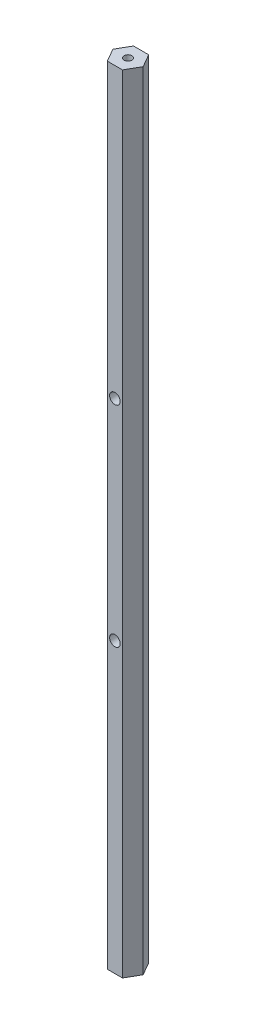
ISO-10303-21;
HEADER;
FILE_DESCRIPTION(('STEP AP214'),'2;1');
FILE_NAME('part.step','',(''),(''),'','','');
FILE_SCHEMA(('AUTOMOTIVE_DESIGN { 1 0 10303 214 1 1 1 1 }'));
ENDSEC;
DATA;
#1=APPLICATION_CONTEXT('core data for automotive mechanical design processes');
#2=APPLICATION_PROTOCOL_DEFINITION('international standard','automotive_design',2000,#1);
#3=PRODUCT_CONTEXT('',#1,'mechanical');
#4=PRODUCT('Part','Part','',(#3));
#5=PRODUCT_RELATED_PRODUCT_CATEGORY('part','',(#4));
#6=PRODUCT_DEFINITION_FORMATION('','',#4);
#7=PRODUCT_DEFINITION_CONTEXT('part definition',#1,'design');
#8=PRODUCT_DEFINITION('design','',#6,#7);
#9=PRODUCT_DEFINITION_SHAPE('','',#8);
#10=(LENGTH_UNIT() NAMED_UNIT(*) SI_UNIT(.MILLI.,.METRE.));
#11=(NAMED_UNIT(*) PLANE_ANGLE_UNIT() SI_UNIT($,.RADIAN.));
#12=(NAMED_UNIT(*) SI_UNIT($,.STERADIAN.) SOLID_ANGLE_UNIT());
#13=UNCERTAINTY_MEASURE_WITH_UNIT(LENGTH_MEASURE(1.E-05),#10,'distance_accuracy_value','');
#14=(GEOMETRIC_REPRESENTATION_CONTEXT(3) GLOBAL_UNCERTAINTY_ASSIGNED_CONTEXT((#13)) GLOBAL_UNIT_ASSIGNED_CONTEXT((#10,
#11,#12)) REPRESENTATION_CONTEXT('',''));
#15=CARTESIAN_POINT('',(0.,0.,0.));
#16=DIRECTION('',(0.,0.,1.));
#17=DIRECTION('',(1.,0.,0.));
#18=AXIS2_PLACEMENT_3D('',#15,#16,#17);
#19=CARTESIAN_POINT('',(3.66617420935418,381.,6.34999999999993));
#20=DIRECTION('',(-0.866025403784441,0.,-0.499999999999995));
#21=DIRECTION('',(-0.499999999999995,0.,0.866025403784442));
#22=AXIS2_PLACEMENT_3D('',#19,#20,#21);
#23=PLANE('',#22);
#24=DIRECTION('',(0.499999999999995,0.,-0.866025403784441));
#25=VECTOR('',#24,1.);
#26=CARTESIAN_POINT('',(3.66617420935418,0.,6.34999999999993));
#27=LINE('',#26,#25);
#28=CARTESIAN_POINT('',(3.66617420935418,0.,6.34999999999993));
#29=VERTEX_POINT('',#28);
#30=CARTESIAN_POINT('',(7.33234841870822,0.,0.));
#31=VERTEX_POINT('',#30);
#32=EDGE_CURVE('E120',#29,#31,#27,.T.);
#33=ORIENTED_EDGE('',*,*,#32,.T.);
#34=DIRECTION('',(0.,-1.,0.));
#35=VECTOR('',#34,1.);
#36=CARTESIAN_POINT('',(7.33234841870822,381.,0.));
#37=LINE('',#36,#35);
#38=CARTESIAN_POINT('',(7.33234841870822,381.,0.));
#39=VERTEX_POINT('',#38);
#40=EDGE_CURVE('E11',#39,#31,#37,.T.);
#41=ORIENTED_EDGE('',*,*,#40,.F.);
#42=DIRECTION('',(0.499999999999995,0.,-0.866025403784441));
#43=VECTOR('',#42,1.);
#44=CARTESIAN_POINT('',(3.66617420935418,381.,6.34999999999993));
#45=LINE('',#44,#43);
#46=CARTESIAN_POINT('',(3.66617420935418,381.,6.34999999999993));
#47=VERTEX_POINT('',#46);
#48=EDGE_CURVE('E131',#47,#39,#45,.T.);
#49=ORIENTED_EDGE('',*,*,#48,.F.);
#50=DIRECTION('',(0.,-1.,0.));
#51=VECTOR('',#50,1.);
#52=CARTESIAN_POINT('',(3.66617420935418,381.,6.34999999999993));
#53=LINE('',#52,#51);
#54=EDGE_CURVE('E116',#47,#29,#53,.T.);
#55=ORIENTED_EDGE('',*,*,#54,.T.);
#56=EDGE_LOOP('',(#33,#41,#49,#55));
#57=FACE_BOUND('',#56,.T.);
#58=ADVANCED_FACE('F33',(#57),#23,.F.);
#59=CARTESIAN_POINT('',(7.33234841870822,381.,0.));
#60=DIRECTION('',(-0.866025403784438,0.,0.500000000000001));
#61=DIRECTION('',(0.500000000000001,0.,0.866025403784438));
#62=AXIS2_PLACEMENT_3D('',#59,#60,#61);
#63=PLANE('',#62);
#64=DIRECTION('',(-0.500000000000001,0.,-0.866025403784438));
#65=VECTOR('',#64,1.);
#66=CARTESIAN_POINT('',(7.33234841870822,0.,0.));
#67=LINE('',#66,#65);
#68=CARTESIAN_POINT('',(3.6661742093541,0.,-6.34999999999998));
#69=VERTEX_POINT('',#68);
#70=EDGE_CURVE('E123',#31,#69,#67,.T.);
#71=ORIENTED_EDGE('',*,*,#70,.T.);
#72=DIRECTION('',(0.,-1.,0.));
#73=VECTOR('',#72,1.);
#74=CARTESIAN_POINT('',(3.6661742093541,381.,-6.34999999999998));
#75=LINE('',#74,#73);
#76=CARTESIAN_POINT('',(3.6661742093541,381.,-6.34999999999998));
#77=VERTEX_POINT('',#76);
#78=EDGE_CURVE('E41',#77,#69,#75,.T.);
#79=ORIENTED_EDGE('',*,*,#78,.F.);
#80=DIRECTION('',(-0.500000000000001,0.,-0.866025403784438));
#81=VECTOR('',#80,1.);
#82=CARTESIAN_POINT('',(7.33234841870822,381.,0.));
#83=LINE('',#82,#81);
#84=EDGE_CURVE('E87',#39,#77,#83,.T.);
#85=ORIENTED_EDGE('',*,*,#84,.F.);
#86=ORIENTED_EDGE('',*,*,#40,.T.);
#87=EDGE_LOOP('',(#71,#79,#85,#86));
#88=FACE_BOUND('',#87,.T.);
#89=ADVANCED_FACE('F161',(#88),#63,.F.);
#90=CARTESIAN_POINT('',(3.6661742093541,381.,-6.34999999999998));
#91=DIRECTION('',(0.,0.,1.));
#92=DIRECTION('',(1.,0.,0.));
#93=AXIS2_PLACEMENT_3D('',#90,#91,#92);
#94=PLANE('',#93);
#95=CARTESIAN_POINT('',(0.,139.7,-6.34999999999997));
#96=DIRECTION('',(0.,0.,-1.));
#97=DIRECTION('',(-1.,0.,0.));
#98=AXIS2_PLACEMENT_3D('',#95,#96,#97);
#99=CIRCLE('',#98,2.5527);
#100=CARTESIAN_POINT('',(-2.55270000000002,139.7,-6.34999999999997));
#101=VERTEX_POINT('',#100);
#102=EDGE_CURVE('E264',#101,#101,#99,.T.);
#103=ORIENTED_EDGE('',*,*,#102,.F.);
#104=EDGE_LOOP('',(#103));
#105=FACE_BOUND('',#104,.T.);
#106=CARTESIAN_POINT('',(0.,241.3,-6.34999999999997));
#107=DIRECTION('',(0.,0.,-1.));
#108=DIRECTION('',(-1.,0.,0.));
#109=AXIS2_PLACEMENT_3D('',#106,#107,#108);
#110=CIRCLE('',#109,2.5527);
#111=CARTESIAN_POINT('',(-2.55270000000002,241.3,-6.34999999999997));
#112=VERTEX_POINT('',#111);
#113=EDGE_CURVE('E266',#112,#112,#110,.T.);
#114=ORIENTED_EDGE('',*,*,#113,.F.);
#115=EDGE_LOOP('',(#114));
#116=FACE_BOUND('',#115,.T.);
#117=DIRECTION('',(-1.,0.,0.));
#118=VECTOR('',#117,1.);
#119=CARTESIAN_POINT('',(3.6661742093541,0.,-6.34999999999998));
#120=LINE('',#119,#118);
#121=CARTESIAN_POINT('',(-3.66617420935414,0.,-6.34999999999996));
#122=VERTEX_POINT('',#121);
#123=EDGE_CURVE('E126',#69,#122,#120,.T.);
#124=ORIENTED_EDGE('',*,*,#123,.T.);
#125=DIRECTION('',(0.,-1.,0.));
#126=VECTOR('',#125,1.);
#127=CARTESIAN_POINT('',(-3.66617420935414,381.,-6.34999999999996));
#128=LINE('',#127,#126);
#129=CARTESIAN_POINT('',(-3.66617420935414,381.,-6.34999999999996));
#130=VERTEX_POINT('',#129);
#131=EDGE_CURVE('E111',#130,#122,#128,.T.);
#132=ORIENTED_EDGE('',*,*,#131,.F.);
#133=DIRECTION('',(-1.,0.,0.));
#134=VECTOR('',#133,1.);
#135=CARTESIAN_POINT('',(3.6661742093541,381.,-6.34999999999998));
#136=LINE('',#135,#134);
#137=EDGE_CURVE('E102',#77,#130,#136,.T.);
#138=ORIENTED_EDGE('',*,*,#137,.F.);
#139=ORIENTED_EDGE('',*,*,#78,.T.);
#140=EDGE_LOOP('',(#124,#132,#138,#139));
#141=FACE_BOUND('',#140,.T.);
#142=ADVANCED_FACE('F137',(#105,#116,#141),#94,.F.);
#143=CARTESIAN_POINT('',(-3.66617420935414,381.,-6.34999999999996));
#144=DIRECTION('',(0.866025403784441,0.,0.499999999999995));
#145=DIRECTION('',(0.499999999999995,0.,-0.866025403784442));
#146=AXIS2_PLACEMENT_3D('',#143,#144,#145);
#147=PLANE('',#146);
#148=DIRECTION('',(-0.499999999999995,0.,0.866025403784442));
#149=VECTOR('',#148,1.);
#150=CARTESIAN_POINT('',(-3.66617420935414,0.,-6.34999999999996));
#151=LINE('',#150,#149);
#152=CARTESIAN_POINT('',(-7.33234841870822,0.,0.));
#153=VERTEX_POINT('',#152);
#154=EDGE_CURVE('E110',#122,#153,#151,.T.);
#155=ORIENTED_EDGE('',*,*,#154,.T.);
#156=DIRECTION('',(0.,-1.,0.));
#157=VECTOR('',#156,1.);
#158=CARTESIAN_POINT('',(-7.33234841870822,381.,0.));
#159=LINE('',#158,#157);
#160=CARTESIAN_POINT('',(-7.33234841870822,381.,0.));
#161=VERTEX_POINT('',#160);
#162=EDGE_CURVE('E107',#161,#153,#159,.T.);
#163=ORIENTED_EDGE('',*,*,#162,.F.);
#164=DIRECTION('',(-0.499999999999995,0.,0.866025403784442));
#165=VECTOR('',#164,1.);
#166=CARTESIAN_POINT('',(-3.66617420935414,381.,-6.34999999999996));
#167=LINE('',#166,#165);
#168=EDGE_CURVE('E96',#130,#161,#167,.T.);
#169=ORIENTED_EDGE('',*,*,#168,.F.);
#170=ORIENTED_EDGE('',*,*,#131,.T.);
#171=EDGE_LOOP('',(#155,#163,#169,#170));
#172=FACE_BOUND('',#171,.T.);
#173=ADVANCED_FACE('F108',(#172),#147,.F.);
#174=CARTESIAN_POINT('',(-7.33234841870822,381.,0.));
#175=DIRECTION('',(0.866025403784435,0.,-0.500000000000007));
#176=DIRECTION('',(-0.500000000000007,0.,-0.866025403784435));
#177=AXIS2_PLACEMENT_3D('',#174,#175,#176);
#178=PLANE('',#177);
#179=DIRECTION('',(0.500000000000007,0.,0.866025403784435));
#180=VECTOR('',#179,1.);
#181=CARTESIAN_POINT('',(-7.33234841870822,0.,0.));
#182=LINE('',#181,#180);
#183=CARTESIAN_POINT('',(-3.66617420935405,0.,6.35000000000001));
#184=VERTEX_POINT('',#183);
#185=EDGE_CURVE('E73',#153,#184,#182,.T.);
#186=ORIENTED_EDGE('',*,*,#185,.T.);
#187=DIRECTION('',(0.,-1.,0.));
#188=VECTOR('',#187,1.);
#189=CARTESIAN_POINT('',(-3.66617420935405,381.,6.35000000000001));
#190=LINE('',#189,#188);
#191=CARTESIAN_POINT('',(-3.66617420935405,381.,6.35000000000001));
#192=VERTEX_POINT('',#191);
#193=EDGE_CURVE('E112',#192,#184,#190,.T.);
#194=ORIENTED_EDGE('',*,*,#193,.F.);
#195=DIRECTION('',(0.500000000000007,0.,0.866025403784435));
#196=VECTOR('',#195,1.);
#197=CARTESIAN_POINT('',(-7.33234841870822,381.,0.));
#198=LINE('',#197,#196);
#199=EDGE_CURVE('E100',#161,#192,#198,.T.);
#200=ORIENTED_EDGE('',*,*,#199,.F.);
#201=ORIENTED_EDGE('',*,*,#162,.T.);
#202=EDGE_LOOP('',(#186,#194,#200,#201));
#203=FACE_BOUND('',#202,.T.);
#204=ADVANCED_FACE('F114',(#203),#178,.F.);
#205=CARTESIAN_POINT('',(-3.66617420935405,381.,6.35000000000001));
#206=DIRECTION('',(0.,0.,-1.));
#207=DIRECTION('',(-1.,0.,0.));
#208=AXIS2_PLACEMENT_3D('',#205,#206,#207);
#209=PLANE('',#208);
#210=CARTESIAN_POINT('',(0.,139.7,6.35000000000004));
#211=DIRECTION('',(0.,0.,-1.));
#212=DIRECTION('',(-1.,0.,0.));
#213=AXIS2_PLACEMENT_3D('',#210,#211,#212);
#214=CIRCLE('',#213,2.5527);
#215=CARTESIAN_POINT('',(-2.55270000000002,139.7,6.35000000000004));
#216=VERTEX_POINT('',#215);
#217=EDGE_CURVE('E261',#216,#216,#214,.T.);
#218=ORIENTED_EDGE('',*,*,#217,.T.);
#219=EDGE_LOOP('',(#218));
#220=FACE_BOUND('',#219,.T.);
#221=CARTESIAN_POINT('',(0.,241.3,6.35000000000004));
#222=DIRECTION('',(0.,0.,-1.));
#223=DIRECTION('',(-1.,0.,0.));
#224=AXIS2_PLACEMENT_3D('',#221,#222,#223);
#225=CIRCLE('',#224,2.5527);
#226=CARTESIAN_POINT('',(-2.55270000000002,241.3,6.35000000000004));
#227=VERTEX_POINT('',#226);
#228=EDGE_CURVE('E271',#227,#227,#225,.T.);
#229=ORIENTED_EDGE('',*,*,#228,.T.);
#230=EDGE_LOOP('',(#229));
#231=FACE_BOUND('',#230,.T.);
#232=DIRECTION('',(1.,0.,0.));
#233=VECTOR('',#232,1.);
#234=CARTESIAN_POINT('',(-3.66617420935405,0.,6.35000000000001));
#235=LINE('',#234,#233);
#236=EDGE_CURVE('E79',#184,#29,#235,.T.);
#237=ORIENTED_EDGE('',*,*,#236,.T.);
#238=ORIENTED_EDGE('',*,*,#54,.F.);
#239=DIRECTION('',(1.,0.,0.));
#240=VECTOR('',#239,1.);
#241=CARTESIAN_POINT('',(-3.66617420935405,381.,6.35000000000001));
#242=LINE('',#241,#240);
#243=EDGE_CURVE('E49',#192,#47,#242,.T.);
#244=ORIENTED_EDGE('',*,*,#243,.F.);
#245=ORIENTED_EDGE('',*,*,#193,.T.);
#246=EDGE_LOOP('',(#237,#238,#244,#245));
#247=FACE_BOUND('',#246,.T.);
#248=ADVANCED_FACE('F144',(#220,#231,#247),#209,.F.);
#249=CARTESIAN_POINT('',(0.,381.,0.));
#250=DIRECTION('',(0.,1.,0.));
#251=DIRECTION('',(0.,0.,1.));
#252=AXIS2_PLACEMENT_3D('',#249,#250,#251);
#253=PLANE('',#252);
#254=CARTESIAN_POINT('',(0.,381.,0.));
#255=DIRECTION('',(0.,1.,0.));
#256=DIRECTION('',(0.,0.,1.));
#257=AXIS2_PLACEMENT_3D('',#254,#255,#256);
#258=CIRCLE('',#257,1.89864999999999);
#259=CARTESIAN_POINT('',(0.,381.,1.89864999999999));
#260=VERTEX_POINT('',#259);
#261=EDGE_CURVE('E280',#260,#260,#258,.T.);
#262=ORIENTED_EDGE('',*,*,#261,.F.);
#263=EDGE_LOOP('',(#262));
#264=FACE_BOUND('',#263,.T.);
#265=ORIENTED_EDGE('',*,*,#48,.T.);
#266=ORIENTED_EDGE('',*,*,#84,.T.);
#267=ORIENTED_EDGE('',*,*,#137,.T.);
#268=ORIENTED_EDGE('',*,*,#168,.T.);
#269=ORIENTED_EDGE('',*,*,#199,.T.);
#270=ORIENTED_EDGE('',*,*,#243,.T.);
#271=EDGE_LOOP('',(#265,#266,#267,#268,#269,#270));
#272=FACE_BOUND('',#271,.T.);
#273=ADVANCED_FACE('F98',(#264,#272),#253,.T.);
#274=CARTESIAN_POINT('',(0.,0.,0.));
#275=DIRECTION('',(0.,1.,0.));
#276=DIRECTION('',(0.,0.,1.));
#277=AXIS2_PLACEMENT_3D('',#274,#275,#276);
#278=PLANE('',#277);
#279=CARTESIAN_POINT('',(0.,0.,0.));
#280=DIRECTION('',(0.,-1.,0.));
#281=DIRECTION('',(0.,0.,-1.));
#282=AXIS2_PLACEMENT_3D('',#279,#280,#281);
#283=CIRCLE('',#282,1.89864999999999);
#284=CARTESIAN_POINT('',(0.,0.,-1.89864999999999));
#285=VERTEX_POINT('',#284);
#286=EDGE_CURVE('E274',#285,#285,#283,.T.);
#287=ORIENTED_EDGE('',*,*,#286,.F.);
#288=EDGE_LOOP('',(#287));
#289=FACE_BOUND('',#288,.T.);
#290=ORIENTED_EDGE('',*,*,#32,.F.);
#291=ORIENTED_EDGE('',*,*,#236,.F.);
#292=ORIENTED_EDGE('',*,*,#185,.F.);
#293=ORIENTED_EDGE('',*,*,#154,.F.);
#294=ORIENTED_EDGE('',*,*,#123,.F.);
#295=ORIENTED_EDGE('',*,*,#70,.F.);
#296=EDGE_LOOP('',(#290,#291,#292,#293,#294,#295));
#297=FACE_BOUND('',#296,.T.);
#298=ADVANCED_FACE('F140',(#289,#297),#278,.F.);
#299=CARTESIAN_POINT('',(0.,355.6,0.));
#300=DIRECTION('',(0.,1.,0.));
#301=DIRECTION('',(0.,0.,1.));
#302=AXIS2_PLACEMENT_3D('',#299,#300,#301);
#303=CONICAL_SURFACE('',#302,1.89864999999999,1.02974425867664);
#304=CARTESIAN_POINT('',(0.,354.459175985683,0.));
#305=VERTEX_POINT('',#304);
#306=VERTEX_LOOP('',#305);
#307=FACE_BOUND('',#306,.T.);
#308=CARTESIAN_POINT('',(0.,355.6,0.));
#309=DIRECTION('',(0.,1.,0.));
#310=DIRECTION('',(0.,0.,1.));
#311=AXIS2_PLACEMENT_3D('',#308,#309,#310);
#312=CIRCLE('',#311,1.89864999999999);
#313=CARTESIAN_POINT('',(0.,355.6,1.89864999999999));
#314=VERTEX_POINT('',#313);
#315=EDGE_CURVE('E124',#314,#314,#312,.T.);
#316=ORIENTED_EDGE('',*,*,#315,.T.);
#317=EDGE_LOOP('',(#316));
#318=FACE_BOUND('',#317,.T.);
#319=ADVANCED_FACE('F195',(#307,#318),#303,.F.);
#320=CARTESIAN_POINT('',(0.,381.,0.));
#321=DIRECTION('',(0.,1.,0.));
#322=DIRECTION('',(0.,0.,1.));
#323=AXIS2_PLACEMENT_3D('',#320,#321,#322);
#324=CYLINDRICAL_SURFACE('',#323,1.89864999999999);
#325=ORIENTED_EDGE('',*,*,#315,.F.);
#326=EDGE_LOOP('',(#325));
#327=FACE_BOUND('',#326,.T.);
#328=ORIENTED_EDGE('',*,*,#261,.T.);
#329=EDGE_LOOP('',(#328));
#330=FACE_BOUND('',#329,.T.);
#331=ADVANCED_FACE('F203',(#327,#330),#324,.F.);
#332=CARTESIAN_POINT('',(0.,25.4,0.));
#333=DIRECTION('',(0.,-1.,0.));
#334=DIRECTION('',(0.,0.,-1.));
#335=AXIS2_PLACEMENT_3D('',#332,#333,#334);
#336=CONICAL_SURFACE('',#335,1.89864999999999,1.02974425867665);
#337=CARTESIAN_POINT('',(0.,26.5408240143167,0.));
#338=VERTEX_POINT('',#337);
#339=VERTEX_LOOP('',#338);
#340=FACE_BOUND('',#339,.T.);
#341=CARTESIAN_POINT('',(0.,25.4,0.));
#342=DIRECTION('',(0.,-1.,0.));
#343=DIRECTION('',(0.,0.,-1.));
#344=AXIS2_PLACEMENT_3D('',#341,#342,#343);
#345=CIRCLE('',#344,1.89864999999999);
#346=CARTESIAN_POINT('',(0.,25.4,-1.89864999999999));
#347=VERTEX_POINT('',#346);
#348=EDGE_CURVE('E277',#347,#347,#345,.T.);
#349=ORIENTED_EDGE('',*,*,#348,.T.);
#350=EDGE_LOOP('',(#349));
#351=FACE_BOUND('',#350,.T.);
#352=ADVANCED_FACE('F210',(#340,#351),#336,.F.);
#353=CARTESIAN_POINT('',(0.,0.,0.));
#354=DIRECTION('',(0.,-1.,0.));
#355=DIRECTION('',(0.,0.,-1.));
#356=AXIS2_PLACEMENT_3D('',#353,#354,#355);
#357=CYLINDRICAL_SURFACE('',#356,1.89864999999999);
#358=ORIENTED_EDGE('',*,*,#348,.F.);
#359=EDGE_LOOP('',(#358));
#360=FACE_BOUND('',#359,.T.);
#361=ORIENTED_EDGE('',*,*,#286,.T.);
#362=EDGE_LOOP('',(#361));
#363=FACE_BOUND('',#362,.T.);
#364=ADVANCED_FACE('F217',(#360,#363),#357,.F.);
#365=CARTESIAN_POINT('',(0.,241.3,-6.34999999999997));
#366=DIRECTION('',(0.,0.,-1.));
#367=DIRECTION('',(-1.,0.,0.));
#368=AXIS2_PLACEMENT_3D('',#365,#366,#367);
#369=CYLINDRICAL_SURFACE('',#368,2.5527);
#370=ORIENTED_EDGE('',*,*,#228,.F.);
#371=EDGE_LOOP('',(#370));
#372=FACE_BOUND('',#371,.T.);
#373=ORIENTED_EDGE('',*,*,#113,.T.);
#374=EDGE_LOOP('',(#373));
#375=FACE_BOUND('',#374,.T.);
#376=ADVANCED_FACE('F225',(#372,#375),#369,.F.);
#377=CARTESIAN_POINT('',(0.,139.7,-6.34999999999997));
#378=DIRECTION('',(0.,0.,-1.));
#379=DIRECTION('',(-1.,0.,0.));
#380=AXIS2_PLACEMENT_3D('',#377,#378,#379);
#381=CYLINDRICAL_SURFACE('',#380,2.5527);
#382=ORIENTED_EDGE('',*,*,#217,.F.);
#383=EDGE_LOOP('',(#382));
#384=FACE_BOUND('',#383,.T.);
#385=ORIENTED_EDGE('',*,*,#102,.T.);
#386=EDGE_LOOP('',(#385));
#387=FACE_BOUND('',#386,.T.);
#388=ADVANCED_FACE('F232',(#384,#387),#381,.F.);
#389=CLOSED_SHELL('',(#58,#89,#142,#173,#204,#248,#273,#298,#319,#331,#352,#364,#376,#388));
#390=MANIFOLD_SOLID_BREP('B2',#389);
#391=ADVANCED_BREP_SHAPE_REPRESENTATION('',(#18,#390),#14);
#392=SHAPE_DEFINITION_REPRESENTATION(#9,#391);
ENDSEC;
END-ISO-10303-21;
